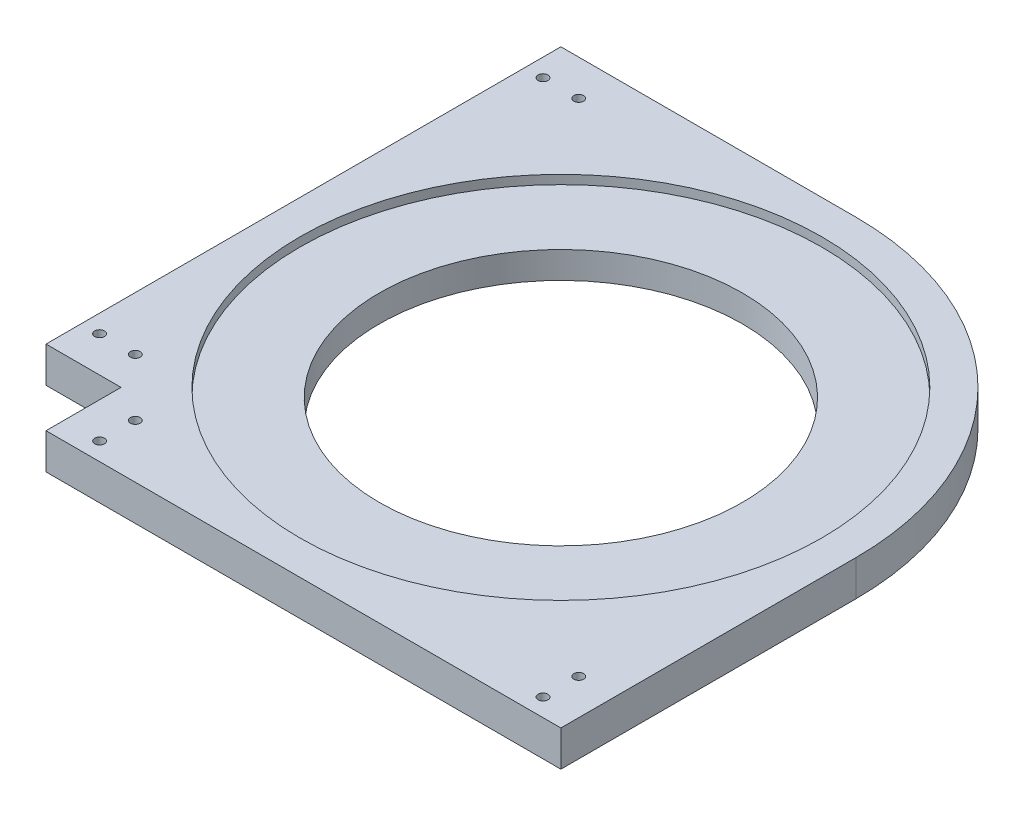
ISO-10303-21;
HEADER;
FILE_DESCRIPTION(('STEP AP214'),'2;1');
FILE_NAME('part.step','',(''),(''),'','','');
FILE_SCHEMA(('AUTOMOTIVE_DESIGN { 1 0 10303 214 1 1 1 1 }'));
ENDSEC;
DATA;
#1=APPLICATION_CONTEXT('core data for automotive mechanical design processes');
#2=APPLICATION_PROTOCOL_DEFINITION('international standard','automotive_design',2000,#1);
#3=PRODUCT_CONTEXT('',#1,'mechanical');
#4=PRODUCT('Part','Part','',(#3));
#5=PRODUCT_RELATED_PRODUCT_CATEGORY('part','',(#4));
#6=PRODUCT_DEFINITION_FORMATION('','',#4);
#7=PRODUCT_DEFINITION_CONTEXT('part definition',#1,'design');
#8=PRODUCT_DEFINITION('design','',#6,#7);
#9=PRODUCT_DEFINITION_SHAPE('','',#8);
#10=(LENGTH_UNIT() NAMED_UNIT(*) SI_UNIT(.MILLI.,.METRE.));
#11=(NAMED_UNIT(*) PLANE_ANGLE_UNIT() SI_UNIT($,.RADIAN.));
#12=(NAMED_UNIT(*) SI_UNIT($,.STERADIAN.) SOLID_ANGLE_UNIT());
#13=UNCERTAINTY_MEASURE_WITH_UNIT(LENGTH_MEASURE(1.E-05),#10,'distance_accuracy_value','');
#14=(GEOMETRIC_REPRESENTATION_CONTEXT(3) GLOBAL_UNCERTAINTY_ASSIGNED_CONTEXT((#13)) GLOBAL_UNIT_ASSIGNED_CONTEXT((#10,
#11,#12)) REPRESENTATION_CONTEXT('',''));
#15=CARTESIAN_POINT('',(0.,0.,0.));
#16=DIRECTION('',(0.,0.,1.));
#17=DIRECTION('',(1.,0.,0.));
#18=AXIS2_PLACEMENT_3D('',#15,#16,#17);
#19=CARTESIAN_POINT('',(0.,20.,0.));
#20=DIRECTION('',(0.,-1.,0.));
#21=DIRECTION('',(0.,0.,-1.));
#22=AXIS2_PLACEMENT_3D('',#19,#20,#21);
#23=CYLINDRICAL_SURFACE('',#22,165.1);
#24=CARTESIAN_POINT('',(0.,0.,0.));
#25=DIRECTION('',(0.,1.,0.));
#26=DIRECTION('',(0.,0.,1.));
#27=AXIS2_PLACEMENT_3D('',#24,#25,#26);
#28=CIRCLE('',#27,165.1);
#29=CARTESIAN_POINT('',(165.1,0.,0.));
#30=VERTEX_POINT('',#29);
#31=CARTESIAN_POINT('',(0.,0.,-165.1));
#32=VERTEX_POINT('',#31);
#33=EDGE_CURVE('E143',#30,#32,#28,.T.);
#34=ORIENTED_EDGE('',*,*,#33,.T.);
#35=DIRECTION('',(0.,-1.,0.));
#36=VECTOR('',#35,1.);
#37=CARTESIAN_POINT('',(0.,20.,-165.1));
#38=LINE('',#37,#36);
#39=CARTESIAN_POINT('',(0.,20.,-165.1));
#40=VERTEX_POINT('',#39);
#41=EDGE_CURVE('E13',#40,#32,#38,.T.);
#42=ORIENTED_EDGE('',*,*,#41,.F.);
#43=CARTESIAN_POINT('',(0.,20.,0.));
#44=DIRECTION('',(0.,1.,0.));
#45=DIRECTION('',(0.,0.,1.));
#46=AXIS2_PLACEMENT_3D('',#43,#44,#45);
#47=CIRCLE('',#46,165.1);
#48=CARTESIAN_POINT('',(165.1,20.,0.));
#49=VERTEX_POINT('',#48);
#50=EDGE_CURVE('E155',#49,#40,#47,.T.);
#51=ORIENTED_EDGE('',*,*,#50,.F.);
#52=DIRECTION('',(0.,-1.,0.));
#53=VECTOR('',#52,1.);
#54=CARTESIAN_POINT('',(165.1,20.,0.));
#55=LINE('',#54,#53);
#56=EDGE_CURVE('E138',#49,#30,#55,.T.);
#57=ORIENTED_EDGE('',*,*,#56,.T.);
#58=EDGE_LOOP('',(#34,#42,#51,#57));
#59=FACE_BOUND('',#58,.T.);
#60=ADVANCED_FACE('F48',(#59),#23,.T.);
#61=CARTESIAN_POINT('',(-165.1,20.,-165.1));
#62=DIRECTION('',(0.,0.,1.));
#63=DIRECTION('',(1.,0.,0.));
#64=AXIS2_PLACEMENT_3D('',#61,#62,#63);
#65=PLANE('',#64);
#66=DIRECTION('',(-1.,0.,0.));
#67=VECTOR('',#66,1.);
#68=CARTESIAN_POINT('',(-165.1,0.,-165.1));
#69=LINE('',#68,#67);
#70=CARTESIAN_POINT('',(-165.1,0.,-165.1));
#71=VERTEX_POINT('',#70);
#72=EDGE_CURVE('E146',#32,#71,#69,.T.);
#73=ORIENTED_EDGE('',*,*,#72,.T.);
#74=DIRECTION('',(0.,-1.,0.));
#75=VECTOR('',#74,1.);
#76=CARTESIAN_POINT('',(-165.1,20.,-165.1));
#77=LINE('',#76,#75);
#78=CARTESIAN_POINT('',(-165.1,20.,-165.1));
#79=VERTEX_POINT('',#78);
#80=EDGE_CURVE('E55',#79,#71,#77,.T.);
#81=ORIENTED_EDGE('',*,*,#80,.F.);
#82=DIRECTION('',(-1.,0.,0.));
#83=VECTOR('',#82,1.);
#84=CARTESIAN_POINT('',(-165.1,20.,-165.1));
#85=LINE('',#84,#83);
#86=EDGE_CURVE('E99',#40,#79,#85,.T.);
#87=ORIENTED_EDGE('',*,*,#86,.F.);
#88=ORIENTED_EDGE('',*,*,#41,.T.);
#89=EDGE_LOOP('',(#73,#81,#87,#88));
#90=FACE_BOUND('',#89,.T.);
#91=ADVANCED_FACE('F189',(#90),#65,.F.);
#92=CARTESIAN_POINT('',(-165.1,20.,165.1));
#93=DIRECTION('',(1.,0.,0.));
#94=DIRECTION('',(0.,0.,-1.));
#95=AXIS2_PLACEMENT_3D('',#92,#93,#94);
#96=PLANE('',#95);
#97=DIRECTION('',(0.,0.,1.));
#98=VECTOR('',#97,1.);
#99=CARTESIAN_POINT('',(-165.1,0.,165.1));
#100=LINE('',#99,#98);
#101=CARTESIAN_POINT('',(-165.1,0.,123.1));
#102=VERTEX_POINT('',#101);
#103=EDGE_CURVE('E149',#71,#102,#100,.T.);
#104=ORIENTED_EDGE('',*,*,#103,.T.);
#105=DIRECTION('',(0.,1.,0.));
#106=VECTOR('',#105,1.);
#107=CARTESIAN_POINT('',(-165.1,-0.001000000000001,123.1));
#108=LINE('',#107,#106);
#109=CARTESIAN_POINT('',(-165.1,20.,123.1));
#110=VERTEX_POINT('',#109);
#111=EDGE_CURVE('E172',#102,#110,#108,.T.);
#112=ORIENTED_EDGE('',*,*,#111,.T.);
#113=DIRECTION('',(0.,0.,1.));
#114=VECTOR('',#113,1.);
#115=CARTESIAN_POINT('',(-165.1,20.,165.1));
#116=LINE('',#115,#114);
#117=EDGE_CURVE('E136',#79,#110,#116,.T.);
#118=ORIENTED_EDGE('',*,*,#117,.F.);
#119=ORIENTED_EDGE('',*,*,#80,.T.);
#120=EDGE_LOOP('',(#104,#112,#118,#119));
#121=FACE_BOUND('',#120,.T.);
#122=ADVANCED_FACE('F161',(#121),#96,.F.);
#123=CARTESIAN_POINT('',(165.1,20.,165.1));
#124=DIRECTION('',(0.,0.,-1.));
#125=DIRECTION('',(-1.,0.,0.));
#126=AXIS2_PLACEMENT_3D('',#123,#124,#125);
#127=PLANE('',#126);
#128=DIRECTION('',(1.,0.,0.));
#129=VECTOR('',#128,1.);
#130=CARTESIAN_POINT('',(165.1,20.,165.1));
#131=LINE('',#130,#129);
#132=CARTESIAN_POINT('',(-123.1,20.,165.1));
#133=VERTEX_POINT('',#132);
#134=CARTESIAN_POINT('',(165.1,20.,165.1));
#135=VERTEX_POINT('',#134);
#136=EDGE_CURVE('E130',#133,#135,#131,.T.);
#137=ORIENTED_EDGE('',*,*,#136,.F.);
#138=DIRECTION('',(0.,1.,0.));
#139=VECTOR('',#138,1.);
#140=CARTESIAN_POINT('',(-123.1,-0.001000000000001,165.1));
#141=LINE('',#140,#139);
#142=CARTESIAN_POINT('',(-123.1,0.,165.1));
#143=VERTEX_POINT('',#142);
#144=EDGE_CURVE('E115',#143,#133,#141,.T.);
#145=ORIENTED_EDGE('',*,*,#144,.F.);
#146=DIRECTION('',(1.,0.,0.));
#147=VECTOR('',#146,1.);
#148=CARTESIAN_POINT('',(165.1,0.,165.1));
#149=LINE('',#148,#147);
#150=CARTESIAN_POINT('',(165.1,0.,165.1));
#151=VERTEX_POINT('',#150);
#152=EDGE_CURVE('E152',#143,#151,#149,.T.);
#153=ORIENTED_EDGE('',*,*,#152,.T.);
#154=DIRECTION('',(0.,-1.,0.));
#155=VECTOR('',#154,1.);
#156=CARTESIAN_POINT('',(165.1,20.,165.1));
#157=LINE('',#156,#155);
#158=EDGE_CURVE('E135',#135,#151,#157,.T.);
#159=ORIENTED_EDGE('',*,*,#158,.F.);
#160=EDGE_LOOP('',(#137,#145,#153,#159));
#161=FACE_BOUND('',#160,.T.);
#162=ADVANCED_FACE('F134',(#161),#127,.F.);
#163=CARTESIAN_POINT('',(165.1,20.,0.));
#164=DIRECTION('',(-1.,0.,0.));
#165=DIRECTION('',(0.,0.,1.));
#166=AXIS2_PLACEMENT_3D('',#163,#164,#165);
#167=PLANE('',#166);
#168=DIRECTION('',(0.,0.,-1.));
#169=VECTOR('',#168,1.);
#170=CARTESIAN_POINT('',(165.1,0.,0.));
#171=LINE('',#170,#169);
#172=EDGE_CURVE('E92',#151,#30,#171,.T.);
#173=ORIENTED_EDGE('',*,*,#172,.T.);
#174=ORIENTED_EDGE('',*,*,#56,.F.);
#175=DIRECTION('',(0.,0.,-1.));
#176=VECTOR('',#175,1.);
#177=CARTESIAN_POINT('',(165.1,20.,0.));
#178=LINE('',#177,#176);
#179=EDGE_CURVE('E71',#135,#49,#178,.T.);
#180=ORIENTED_EDGE('',*,*,#179,.F.);
#181=ORIENTED_EDGE('',*,*,#158,.T.);
#182=EDGE_LOOP('',(#173,#174,#180,#181));
#183=FACE_BOUND('',#182,.T.);
#184=ADVANCED_FACE('F199',(#183),#167,.F.);
#185=CARTESIAN_POINT('',(0.,20.,0.));
#186=DIRECTION('',(0.,1.,0.));
#187=DIRECTION('',(0.,0.,1.));
#188=AXIS2_PLACEMENT_3D('',#185,#186,#187);
#189=PLANE('',#188);
#190=CARTESIAN_POINT('',(-155.1,20.,-145.1));
#191=DIRECTION('',(0.,1.,0.));
#192=DIRECTION('',(0.,0.,-1.));
#193=AXIS2_PLACEMENT_3D('',#190,#191,#192);
#194=CIRCLE('',#193,2.74999999999997);
#195=CARTESIAN_POINT('',(-155.1,20.,-147.85));
#196=VERTEX_POINT('',#195);
#197=EDGE_CURVE('E278',#196,#196,#194,.T.);
#198=ORIENTED_EDGE('',*,*,#197,.F.);
#199=EDGE_LOOP('',(#198));
#200=FACE_BOUND('',#199,.T.);
#201=CARTESIAN_POINT('',(145.1,20.,155.1));
#202=DIRECTION('',(0.,1.,0.));
#203=DIRECTION('',(0.,0.,1.));
#204=AXIS2_PLACEMENT_3D('',#201,#202,#203);
#205=CIRCLE('',#204,2.75000000000001);
#206=CARTESIAN_POINT('',(145.1,20.,157.85));
#207=VERTEX_POINT('',#206);
#208=EDGE_CURVE('E282',#207,#207,#205,.T.);
#209=ORIENTED_EDGE('',*,*,#208,.F.);
#210=EDGE_LOOP('',(#209));
#211=FACE_BOUND('',#210,.T.);
#212=CARTESIAN_POINT('',(-103.1,20.,155.1));
#213=DIRECTION('',(0.,1.,0.));
#214=DIRECTION('',(0.,0.,1.));
#215=AXIS2_PLACEMENT_3D('',#212,#213,#214);
#216=CIRCLE('',#215,2.75000000000001);
#217=CARTESIAN_POINT('',(-103.1,20.,157.85));
#218=VERTEX_POINT('',#217);
#219=EDGE_CURVE('E289',#218,#218,#216,.T.);
#220=ORIENTED_EDGE('',*,*,#219,.F.);
#221=EDGE_LOOP('',(#220));
#222=FACE_BOUND('',#221,.T.);
#223=CARTESIAN_POINT('',(145.1,20.,135.1));
#224=DIRECTION('',(0.,1.,0.));
#225=DIRECTION('',(0.,0.,1.));
#226=AXIS2_PLACEMENT_3D('',#223,#224,#225);
#227=CIRCLE('',#226,2.75000000000001);
#228=CARTESIAN_POINT('',(145.1,20.,137.85));
#229=VERTEX_POINT('',#228);
#230=EDGE_CURVE('E294',#229,#229,#227,.T.);
#231=ORIENTED_EDGE('',*,*,#230,.F.);
#232=EDGE_LOOP('',(#231));
#233=FACE_BOUND('',#232,.T.);
#234=CARTESIAN_POINT('',(-135.1,20.,103.1));
#235=DIRECTION('',(0.,1.,0.));
#236=DIRECTION('',(0.,0.,-1.));
#237=AXIS2_PLACEMENT_3D('',#234,#235,#236);
#238=CIRCLE('',#237,2.75000000000001);
#239=CARTESIAN_POINT('',(-135.1,20.,100.35));
#240=VERTEX_POINT('',#239);
#241=EDGE_CURVE('E261',#240,#240,#238,.T.);
#242=ORIENTED_EDGE('',*,*,#241,.F.);
#243=EDGE_LOOP('',(#242));
#244=FACE_BOUND('',#243,.T.);
#245=CARTESIAN_POINT('',(-135.1,20.,-145.1));
#246=DIRECTION('',(0.,1.,0.));
#247=DIRECTION('',(0.,0.,-1.));
#248=AXIS2_PLACEMENT_3D('',#245,#246,#247);
#249=CIRCLE('',#248,2.74999999999997);
#250=CARTESIAN_POINT('',(-135.1,20.,-147.85));
#251=VERTEX_POINT('',#250);
#252=EDGE_CURVE('E266',#251,#251,#249,.T.);
#253=ORIENTED_EDGE('',*,*,#252,.F.);
#254=EDGE_LOOP('',(#253));
#255=FACE_BOUND('',#254,.T.);
#256=CARTESIAN_POINT('',(-155.1,20.,103.1));
#257=DIRECTION('',(0.,1.,0.));
#258=DIRECTION('',(0.,0.,-1.));
#259=AXIS2_PLACEMENT_3D('',#256,#257,#258);
#260=CIRCLE('',#259,2.75000000000001);
#261=CARTESIAN_POINT('',(-155.1,20.,100.35));
#262=VERTEX_POINT('',#261);
#263=EDGE_CURVE('E273',#262,#262,#260,.T.);
#264=ORIENTED_EDGE('',*,*,#263,.F.);
#265=EDGE_LOOP('',(#264));
#266=FACE_BOUND('',#265,.T.);
#267=CARTESIAN_POINT('',(-103.1,20.,135.1));
#268=DIRECTION('',(0.,1.,0.));
#269=DIRECTION('',(0.,0.,1.));
#270=AXIS2_PLACEMENT_3D('',#267,#268,#269);
#271=CIRCLE('',#270,2.75000000000001);
#272=CARTESIAN_POINT('',(-103.1,20.,137.85));
#273=VERTEX_POINT('',#272);
#274=EDGE_CURVE('E301',#273,#273,#271,.T.);
#275=ORIENTED_EDGE('',*,*,#274,.F.);
#276=EDGE_LOOP('',(#275));
#277=FACE_BOUND('',#276,.T.);
#278=DIRECTION('',(-1.,0.,0.));
#279=VECTOR('',#278,1.);
#280=CARTESIAN_POINT('',(-165.1,20.,123.1));
#281=LINE('',#280,#279);
#282=CARTESIAN_POINT('',(-123.1,20.,123.1));
#283=VERTEX_POINT('',#282);
#284=EDGE_CURVE('E126',#283,#110,#281,.T.);
#285=ORIENTED_EDGE('',*,*,#284,.F.);
#286=DIRECTION('',(0.,0.,-1.));
#287=VECTOR('',#286,1.);
#288=CARTESIAN_POINT('',(-123.1,20.,165.1));
#289=LINE('',#288,#287);
#290=EDGE_CURVE('E118',#133,#283,#289,.T.);
#291=ORIENTED_EDGE('',*,*,#290,.F.);
#292=ORIENTED_EDGE('',*,*,#136,.T.);
#293=ORIENTED_EDGE('',*,*,#179,.T.);
#294=ORIENTED_EDGE('',*,*,#50,.T.);
#295=ORIENTED_EDGE('',*,*,#86,.T.);
#296=ORIENTED_EDGE('',*,*,#117,.T.);
#297=EDGE_LOOP('',(#285,#291,#292,#293,#294,#295,#296));
#298=FACE_BOUND('',#297,.T.);
#299=CARTESIAN_POINT('',(0.,20.,0.));
#300=DIRECTION('',(0.,1.,0.));
#301=DIRECTION('',(0.,0.,1.));
#302=AXIS2_PLACEMENT_3D('',#299,#300,#301);
#303=CIRCLE('',#302,146.05);
#304=CARTESIAN_POINT('',(0.,20.,146.05));
#305=VERTEX_POINT('',#304);
#306=EDGE_CURVE('E181',#305,#305,#303,.T.);
#307=ORIENTED_EDGE('',*,*,#306,.F.);
#308=EDGE_LOOP('',(#307));
#309=FACE_BOUND('',#308,.T.);
#310=ADVANCED_FACE('F128',(#200,#211,#222,#233,#244,#255,#266,#277,#298,#309),#189,.T.);
#311=CARTESIAN_POINT('',(0.,0.,0.));
#312=DIRECTION('',(0.,1.,0.));
#313=DIRECTION('',(0.,0.,1.));
#314=AXIS2_PLACEMENT_3D('',#311,#312,#313);
#315=PLANE('',#314);
#316=CARTESIAN_POINT('',(-155.1,0.,-145.1));
#317=DIRECTION('',(0.,1.,0.));
#318=DIRECTION('',(0.,0.,1.));
#319=AXIS2_PLACEMENT_3D('',#316,#317,#318);
#320=CIRCLE('',#319,2.74999999999997);
#321=CARTESIAN_POINT('',(-155.1,0.,-142.35));
#322=VERTEX_POINT('',#321);
#323=EDGE_CURVE('E286',#322,#322,#320,.F.);
#324=ORIENTED_EDGE('',*,*,#323,.F.);
#325=EDGE_LOOP('',(#324));
#326=FACE_BOUND('',#325,.T.);
#327=CARTESIAN_POINT('',(145.1,0.,155.1));
#328=DIRECTION('',(0.,1.,0.));
#329=DIRECTION('',(0.,0.,1.));
#330=AXIS2_PLACEMENT_3D('',#327,#328,#329);
#331=CIRCLE('',#330,2.75000000000001);
#332=CARTESIAN_POINT('',(145.1,0.,157.85));
#333=VERTEX_POINT('',#332);
#334=EDGE_CURVE('E285',#333,#333,#331,.F.);
#335=ORIENTED_EDGE('',*,*,#334,.F.);
#336=EDGE_LOOP('',(#335));
#337=FACE_BOUND('',#336,.T.);
#338=CARTESIAN_POINT('',(-103.1,0.,155.1));
#339=DIRECTION('',(0.,1.,0.));
#340=DIRECTION('',(0.,0.,1.));
#341=AXIS2_PLACEMENT_3D('',#338,#339,#340);
#342=CIRCLE('',#341,2.75000000000001);
#343=CARTESIAN_POINT('',(-103.1,0.,157.85));
#344=VERTEX_POINT('',#343);
#345=EDGE_CURVE('E298',#344,#344,#342,.F.);
#346=ORIENTED_EDGE('',*,*,#345,.F.);
#347=EDGE_LOOP('',(#346));
#348=FACE_BOUND('',#347,.T.);
#349=CARTESIAN_POINT('',(145.1,0.,135.1));
#350=DIRECTION('',(0.,1.,0.));
#351=DIRECTION('',(0.,0.,1.));
#352=AXIS2_PLACEMENT_3D('',#349,#350,#351);
#353=CIRCLE('',#352,2.75000000000001);
#354=CARTESIAN_POINT('',(145.1,0.,137.85));
#355=VERTEX_POINT('',#354);
#356=EDGE_CURVE('E297',#355,#355,#353,.F.);
#357=ORIENTED_EDGE('',*,*,#356,.F.);
#358=EDGE_LOOP('',(#357));
#359=FACE_BOUND('',#358,.T.);
#360=CARTESIAN_POINT('',(-135.1,0.,103.1));
#361=DIRECTION('',(0.,1.,0.));
#362=DIRECTION('',(0.,0.,1.));
#363=AXIS2_PLACEMENT_3D('',#360,#361,#362);
#364=CIRCLE('',#363,2.75000000000001);
#365=CARTESIAN_POINT('',(-135.1,0.,105.85));
#366=VERTEX_POINT('',#365);
#367=EDGE_CURVE('E264',#366,#366,#364,.F.);
#368=ORIENTED_EDGE('',*,*,#367,.F.);
#369=EDGE_LOOP('',(#368));
#370=FACE_BOUND('',#369,.T.);
#371=CARTESIAN_POINT('',(-135.1,0.,-145.1));
#372=DIRECTION('',(0.,1.,0.));
#373=DIRECTION('',(0.,0.,1.));
#374=AXIS2_PLACEMENT_3D('',#371,#372,#373);
#375=CIRCLE('',#374,2.74999999999997);
#376=CARTESIAN_POINT('',(-135.1,0.,-142.35));
#377=VERTEX_POINT('',#376);
#378=EDGE_CURVE('E269',#377,#377,#375,.F.);
#379=ORIENTED_EDGE('',*,*,#378,.F.);
#380=EDGE_LOOP('',(#379));
#381=FACE_BOUND('',#380,.T.);
#382=CARTESIAN_POINT('',(-155.1,0.,103.1));
#383=DIRECTION('',(0.,1.,0.));
#384=DIRECTION('',(0.,0.,1.));
#385=AXIS2_PLACEMENT_3D('',#382,#383,#384);
#386=CIRCLE('',#385,2.75000000000001);
#387=CARTESIAN_POINT('',(-155.1,0.,105.85));
#388=VERTEX_POINT('',#387);
#389=EDGE_CURVE('E276',#388,#388,#386,.F.);
#390=ORIENTED_EDGE('',*,*,#389,.F.);
#391=EDGE_LOOP('',(#390));
#392=FACE_BOUND('',#391,.T.);
#393=CARTESIAN_POINT('',(-103.1,0.,135.1));
#394=DIRECTION('',(0.,1.,0.));
#395=DIRECTION('',(0.,0.,1.));
#396=AXIS2_PLACEMENT_3D('',#393,#394,#395);
#397=CIRCLE('',#396,2.75000000000001);
#398=CARTESIAN_POINT('',(-103.1,0.,137.85));
#399=VERTEX_POINT('',#398);
#400=EDGE_CURVE('E167',#399,#399,#397,.F.);
#401=ORIENTED_EDGE('',*,*,#400,.F.);
#402=EDGE_LOOP('',(#401));
#403=FACE_BOUND('',#402,.T.);
#404=CARTESIAN_POINT('',(0.,0.,0.));
#405=DIRECTION('',(0.,1.,0.));
#406=DIRECTION('',(0.,0.,1.));
#407=AXIS2_PLACEMENT_3D('',#404,#405,#406);
#408=CIRCLE('',#407,101.6);
#409=CARTESIAN_POINT('',(0.,0.,101.6));
#410=VERTEX_POINT('',#409);
#411=EDGE_CURVE('E178',#410,#410,#408,.F.);
#412=ORIENTED_EDGE('',*,*,#411,.F.);
#413=EDGE_LOOP('',(#412));
#414=FACE_BOUND('',#413,.T.);
#415=DIRECTION('',(0.,0.,1.));
#416=VECTOR('',#415,1.);
#417=CARTESIAN_POINT('',(-123.1,0.,165.1));
#418=LINE('',#417,#416);
#419=CARTESIAN_POINT('',(-123.1,0.,123.1));
#420=VERTEX_POINT('',#419);
#421=EDGE_CURVE('E121',#420,#143,#418,.T.);
#422=ORIENTED_EDGE('',*,*,#421,.F.);
#423=DIRECTION('',(1.,0.,0.));
#424=VECTOR('',#423,1.);
#425=CARTESIAN_POINT('',(-165.1,0.,123.1));
#426=LINE('',#425,#424);
#427=EDGE_CURVE('E62',#102,#420,#426,.T.);
#428=ORIENTED_EDGE('',*,*,#427,.F.);
#429=ORIENTED_EDGE('',*,*,#103,.F.);
#430=ORIENTED_EDGE('',*,*,#72,.F.);
#431=ORIENTED_EDGE('',*,*,#33,.F.);
#432=ORIENTED_EDGE('',*,*,#172,.F.);
#433=ORIENTED_EDGE('',*,*,#152,.F.);
#434=EDGE_LOOP('',(#422,#428,#429,#430,#431,#432,#433));
#435=FACE_BOUND('',#434,.T.);
#436=ADVANCED_FACE('F164',(#326,#337,#348,#359,#370,#381,#392,#403,#414,#435),#315,.F.);
#437=CARTESIAN_POINT('',(0.,15.,0.));
#438=DIRECTION('',(0.,1.,0.));
#439=DIRECTION('',(0.,0.,1.));
#440=AXIS2_PLACEMENT_3D('',#437,#438,#439);
#441=CYLINDRICAL_SURFACE('',#440,146.05);
#442=CARTESIAN_POINT('',(0.,15.,0.));
#443=DIRECTION('',(0.,1.,0.));
#444=DIRECTION('',(0.,0.,1.));
#445=AXIS2_PLACEMENT_3D('',#442,#443,#444);
#446=CIRCLE('',#445,146.05);
#447=CARTESIAN_POINT('',(0.,15.,146.05));
#448=VERTEX_POINT('',#447);
#449=EDGE_CURVE('E147',#448,#448,#446,.T.);
#450=ORIENTED_EDGE('',*,*,#449,.F.);
#451=EDGE_LOOP('',(#450));
#452=FACE_BOUND('',#451,.T.);
#453=ORIENTED_EDGE('',*,*,#306,.T.);
#454=EDGE_LOOP('',(#453));
#455=FACE_BOUND('',#454,.T.);
#456=ADVANCED_FACE('F204',(#452,#455),#441,.F.);
#457=CARTESIAN_POINT('',(0.,15.,0.));
#458=DIRECTION('',(0.,1.,0.));
#459=DIRECTION('',(0.,0.,1.));
#460=AXIS2_PLACEMENT_3D('',#457,#458,#459);
#461=PLANE('',#460);
#462=CARTESIAN_POINT('',(0.,15.,0.));
#463=DIRECTION('',(0.,1.,0.));
#464=DIRECTION('',(0.,0.,1.));
#465=AXIS2_PLACEMENT_3D('',#462,#463,#464);
#466=CIRCLE('',#465,101.6);
#467=CARTESIAN_POINT('',(0.,15.,101.6));
#468=VERTEX_POINT('',#467);
#469=EDGE_CURVE('E174',#468,#468,#466,.T.);
#470=ORIENTED_EDGE('',*,*,#469,.F.);
#471=EDGE_LOOP('',(#470));
#472=FACE_BOUND('',#471,.T.);
#473=ORIENTED_EDGE('',*,*,#449,.T.);
#474=EDGE_LOOP('',(#473));
#475=FACE_BOUND('',#474,.T.);
#476=ADVANCED_FACE('F211',(#472,#475),#461,.T.);
#477=CARTESIAN_POINT('',(0.,-0.000999999999999265,0.));
#478=DIRECTION('',(0.,1.,0.));
#479=DIRECTION('',(0.,0.,1.));
#480=AXIS2_PLACEMENT_3D('',#477,#478,#479);
#481=CYLINDRICAL_SURFACE('',#480,101.6);
#482=CARTESIAN_POINT('',(0.,15.,101.6));
#483=CARTESIAN_POINT('',(0.,14.84375,101.6));
#484=CARTESIAN_POINT('',(0.,14.6875,101.6));
#485=CARTESIAN_POINT('',(0.,14.375,101.6));
#486=CARTESIAN_POINT('',(0.,14.21875,101.6));
#487=CARTESIAN_POINT('',(0.,13.90625,101.6));
#488=CARTESIAN_POINT('',(0.,13.75,101.6));
#489=CARTESIAN_POINT('',(0.,13.4375,101.6));
#490=CARTESIAN_POINT('',(0.,13.28125,101.6));
#491=CARTESIAN_POINT('',(0.,12.96875,101.6));
#492=CARTESIAN_POINT('',(0.,12.8125,101.6));
#493=CARTESIAN_POINT('',(0.,12.5,101.6));
#494=CARTESIAN_POINT('',(0.,12.34375,101.6));
#495=CARTESIAN_POINT('',(0.,12.03125,101.6));
#496=CARTESIAN_POINT('',(0.,11.875,101.6));
#497=CARTESIAN_POINT('',(0.,11.5625,101.6));
#498=CARTESIAN_POINT('',(0.,11.40625,101.6));
#499=CARTESIAN_POINT('',(0.,11.09375,101.6));
#500=CARTESIAN_POINT('',(0.,10.9375,101.6));
#501=CARTESIAN_POINT('',(0.,10.625,101.6));
#502=CARTESIAN_POINT('',(0.,10.46875,101.6));
#503=CARTESIAN_POINT('',(0.,10.15625,101.6));
#504=CARTESIAN_POINT('',(0.,10.,101.6));
#505=CARTESIAN_POINT('',(0.,9.6875,101.6));
#506=CARTESIAN_POINT('',(0.,9.53125,101.6));
#507=CARTESIAN_POINT('',(0.,9.21875,101.6));
#508=CARTESIAN_POINT('',(0.,9.0625,101.6));
#509=CARTESIAN_POINT('',(0.,8.75,101.6));
#510=CARTESIAN_POINT('',(0.,8.59375,101.6));
#511=CARTESIAN_POINT('',(0.,8.28125,101.6));
#512=CARTESIAN_POINT('',(0.,8.125,101.6));
#513=CARTESIAN_POINT('',(0.,7.8125,101.6));
#514=CARTESIAN_POINT('',(0.,7.65625,101.6));
#515=CARTESIAN_POINT('',(0.,7.34375,101.6));
#516=CARTESIAN_POINT('',(0.,7.1875,101.6));
#517=CARTESIAN_POINT('',(0.,6.875,101.6));
#518=CARTESIAN_POINT('',(0.,6.71875,101.6));
#519=CARTESIAN_POINT('',(0.,6.40625,101.6));
#520=CARTESIAN_POINT('',(0.,6.25,101.6));
#521=CARTESIAN_POINT('',(0.,5.9375,101.6));
#522=CARTESIAN_POINT('',(0.,5.78125,101.6));
#523=CARTESIAN_POINT('',(0.,5.46875,101.6));
#524=CARTESIAN_POINT('',(0.,5.3125,101.6));
#525=CARTESIAN_POINT('',(0.,5.,101.6));
#526=CARTESIAN_POINT('',(0.,4.84375,101.6));
#527=CARTESIAN_POINT('',(0.,4.53125,101.6));
#528=CARTESIAN_POINT('',(0.,4.375,101.6));
#529=CARTESIAN_POINT('',(0.,4.0625,101.6));
#530=CARTESIAN_POINT('',(0.,3.90625,101.6));
#531=CARTESIAN_POINT('',(0.,3.59375,101.6));
#532=CARTESIAN_POINT('',(0.,3.4375,101.6));
#533=CARTESIAN_POINT('',(0.,3.125,101.6));
#534=CARTESIAN_POINT('',(0.,2.96875,101.6));
#535=CARTESIAN_POINT('',(0.,2.65625,101.6));
#536=CARTESIAN_POINT('',(0.,2.5,101.6));
#537=CARTESIAN_POINT('',(0.,2.1875,101.6));
#538=CARTESIAN_POINT('',(0.,2.03125,101.6));
#539=CARTESIAN_POINT('',(0.,1.71875,101.6));
#540=CARTESIAN_POINT('',(0.,1.5625,101.6));
#541=CARTESIAN_POINT('',(0.,1.25,101.6));
#542=CARTESIAN_POINT('',(0.,1.09375,101.6));
#543=CARTESIAN_POINT('',(0.,0.781250000000001,101.6));
#544=CARTESIAN_POINT('',(0.,0.625,101.6));
#545=CARTESIAN_POINT('',(0.,0.3125,101.6));
#546=CARTESIAN_POINT('',(0.,0.15625,101.6));
#547=CARTESIAN_POINT('',(0.,0.,101.6));
#548=B_SPLINE_CURVE_WITH_KNOTS('',3,(#482,#483,#484,#485,#486,#487,#488,#489,#490,#491,#492,
#493,#494,#495,#496,#497,#498,#499,#500,#501,#502,#503,#504,#505,#506,#507,#508,#509,#510,#511,
#512,#513,#514,#515,#516,#517,#518,#519,#520,#521,#522,#523,#524,#525,#526,#527,#528,#529,#530,
#531,#532,#533,#534,#535,#536,#537,#538,#539,#540,#541,#542,#543,#544,#545,#546,#547),
.UNSPECIFIED.,.F.,.F.,(4,2,2,2,2,2,2,2,2,2,2,2,2,2,2,2,2,2,2,2,2,2,2,2,2,2,2,2,2,2,2,2,4),(0.,
0.46875,0.937500000000001,1.40625,1.875,2.34375,2.8125,3.28125,3.75,4.21875,4.6875,5.15625,
5.625,6.09375,6.5625,7.03125,7.5,7.96875,8.4375,8.90625,9.375,9.84375,10.3125,10.78125,11.25,
11.71875,12.1875,12.65625,13.125,13.59375,14.0625,14.53125,15.),.UNSPECIFIED.);
#549=EDGE_CURVE('BSEAM215',#468,#410,#548,.T.);
#550=ORIENTED_EDGE('',*,*,#469,.T.);
#551=ORIENTED_EDGE('',*,*,#411,.T.);
#552=ORIENTED_EDGE('',*,*,#549,.T.);
#553=ORIENTED_EDGE('',*,*,#549,.F.);
#554=EDGE_LOOP('',(#550,#552,#551,#553));
#555=FACE_BOUND('',#554,.T.);
#556=ADVANCED_FACE('F215',(#555),#481,.F.);
#557=CARTESIAN_POINT('',(-165.1,-0.001000000000001,123.1));
#558=DIRECTION('',(0.,0.,-1.));
#559=DIRECTION('',(-1.,0.,0.));
#560=AXIS2_PLACEMENT_3D('',#557,#558,#559);
#561=PLANE('',#560);
#562=ORIENTED_EDGE('',*,*,#427,.T.);
#563=DIRECTION('',(0.,1.,0.));
#564=VECTOR('',#563,1.);
#565=CARTESIAN_POINT('',(-123.1,-0.001000000000001,123.1));
#566=LINE('',#565,#564);
#567=EDGE_CURVE('E125',#420,#283,#566,.T.);
#568=ORIENTED_EDGE('',*,*,#567,.T.);
#569=ORIENTED_EDGE('',*,*,#284,.T.);
#570=ORIENTED_EDGE('',*,*,#111,.F.);
#571=EDGE_LOOP('',(#562,#568,#569,#570));
#572=FACE_BOUND('',#571,.T.);
#573=ADVANCED_FACE('F219',(#572),#561,.F.);
#574=CARTESIAN_POINT('',(-123.1,-0.001000000000001,165.1));
#575=DIRECTION('',(1.,0.,0.));
#576=DIRECTION('',(0.,0.,-1.));
#577=AXIS2_PLACEMENT_3D('',#574,#575,#576);
#578=PLANE('',#577);
#579=ORIENTED_EDGE('',*,*,#421,.T.);
#580=ORIENTED_EDGE('',*,*,#144,.T.);
#581=ORIENTED_EDGE('',*,*,#290,.T.);
#582=ORIENTED_EDGE('',*,*,#567,.F.);
#583=EDGE_LOOP('',(#579,#580,#581,#582));
#584=FACE_BOUND('',#583,.T.);
#585=ADVANCED_FACE('F117',(#584),#578,.F.);
#586=CARTESIAN_POINT('',(-103.1,-0.001000000000001,135.1));
#587=DIRECTION('',(0.,1.,0.));
#588=DIRECTION('',(0.,0.,1.));
#589=AXIS2_PLACEMENT_3D('',#586,#587,#588);
#590=CYLINDRICAL_SURFACE('',#589,2.75000000000001);
#591=ORIENTED_EDGE('',*,*,#274,.T.);
#592=EDGE_LOOP('',(#591));
#593=FACE_BOUND('',#592,.T.);
#594=ORIENTED_EDGE('',*,*,#400,.T.);
#595=EDGE_LOOP('',(#594));
#596=FACE_BOUND('',#595,.T.);
#597=ADVANCED_FACE('F223',(#593,#596),#590,.F.);
#598=CARTESIAN_POINT('',(-155.1,-0.001000000000001,103.1));
#599=DIRECTION('',(0.,1.,0.));
#600=DIRECTION('',(0.,0.,1.));
#601=AXIS2_PLACEMENT_3D('',#598,#599,#600);
#602=CYLINDRICAL_SURFACE('',#601,2.75000000000001);
#603=ORIENTED_EDGE('',*,*,#263,.T.);
#604=EDGE_LOOP('',(#603));
#605=FACE_BOUND('',#604,.T.);
#606=ORIENTED_EDGE('',*,*,#389,.T.);
#607=EDGE_LOOP('',(#606));
#608=FACE_BOUND('',#607,.T.);
#609=ADVANCED_FACE('F228',(#605,#608),#602,.F.);
#610=CARTESIAN_POINT('',(-135.1,-0.001000000000001,-145.1));
#611=DIRECTION('',(0.,1.,0.));
#612=DIRECTION('',(0.,0.,1.));
#613=AXIS2_PLACEMENT_3D('',#610,#611,#612);
#614=CYLINDRICAL_SURFACE('',#613,2.74999999999997);
#615=ORIENTED_EDGE('',*,*,#252,.T.);
#616=EDGE_LOOP('',(#615));
#617=FACE_BOUND('',#616,.T.);
#618=ORIENTED_EDGE('',*,*,#378,.T.);
#619=EDGE_LOOP('',(#618));
#620=FACE_BOUND('',#619,.T.);
#621=ADVANCED_FACE('F247',(#617,#620),#614,.F.);
#622=CARTESIAN_POINT('',(-135.1,-0.001000000000001,103.1));
#623=DIRECTION('',(0.,1.,0.));
#624=DIRECTION('',(0.,0.,1.));
#625=AXIS2_PLACEMENT_3D('',#622,#623,#624);
#626=CYLINDRICAL_SURFACE('',#625,2.75000000000001);
#627=ORIENTED_EDGE('',*,*,#241,.T.);
#628=EDGE_LOOP('',(#627));
#629=FACE_BOUND('',#628,.T.);
#630=ORIENTED_EDGE('',*,*,#367,.T.);
#631=EDGE_LOOP('',(#630));
#632=FACE_BOUND('',#631,.T.);
#633=ADVANCED_FACE('F238',(#629,#632),#626,.F.);
#634=CARTESIAN_POINT('',(145.1,-0.001000000000001,135.1));
#635=DIRECTION('',(0.,1.,0.));
#636=DIRECTION('',(0.,0.,1.));
#637=AXIS2_PLACEMENT_3D('',#634,#635,#636);
#638=CYLINDRICAL_SURFACE('',#637,2.75000000000001);
#639=ORIENTED_EDGE('',*,*,#230,.T.);
#640=EDGE_LOOP('',(#639));
#641=FACE_BOUND('',#640,.T.);
#642=ORIENTED_EDGE('',*,*,#356,.T.);
#643=EDGE_LOOP('',(#642));
#644=FACE_BOUND('',#643,.T.);
#645=ADVANCED_FACE('F234',(#641,#644),#638,.F.);
#646=CARTESIAN_POINT('',(-103.1,-0.001000000000001,155.1));
#647=DIRECTION('',(0.,1.,0.));
#648=DIRECTION('',(0.,0.,1.));
#649=AXIS2_PLACEMENT_3D('',#646,#647,#648);
#650=CYLINDRICAL_SURFACE('',#649,2.75000000000001);
#651=ORIENTED_EDGE('',*,*,#219,.T.);
#652=EDGE_LOOP('',(#651));
#653=FACE_BOUND('',#652,.T.);
#654=ORIENTED_EDGE('',*,*,#345,.T.);
#655=EDGE_LOOP('',(#654));
#656=FACE_BOUND('',#655,.T.);
#657=ADVANCED_FACE('F230',(#653,#656),#650,.F.);
#658=CARTESIAN_POINT('',(145.1,-0.001000000000001,155.1));
#659=DIRECTION('',(0.,1.,0.));
#660=DIRECTION('',(0.,0.,1.));
#661=AXIS2_PLACEMENT_3D('',#658,#659,#660);
#662=CYLINDRICAL_SURFACE('',#661,2.75000000000001);
#663=ORIENTED_EDGE('',*,*,#208,.T.);
#664=EDGE_LOOP('',(#663));
#665=FACE_BOUND('',#664,.T.);
#666=ORIENTED_EDGE('',*,*,#334,.T.);
#667=EDGE_LOOP('',(#666));
#668=FACE_BOUND('',#667,.T.);
#669=ADVANCED_FACE('F233',(#665,#668),#662,.F.);
#670=CARTESIAN_POINT('',(-155.1,-0.001000000000001,-145.1));
#671=DIRECTION('',(0.,1.,0.));
#672=DIRECTION('',(0.,0.,1.));
#673=AXIS2_PLACEMENT_3D('',#670,#671,#672);
#674=CYLINDRICAL_SURFACE('',#673,2.74999999999997);
#675=ORIENTED_EDGE('',*,*,#197,.T.);
#676=EDGE_LOOP('',(#675));
#677=FACE_BOUND('',#676,.T.);
#678=ORIENTED_EDGE('',*,*,#323,.T.);
#679=EDGE_LOOP('',(#678));
#680=FACE_BOUND('',#679,.T.);
#681=ADVANCED_FACE('F240',(#677,#680),#674,.F.);
#682=CLOSED_SHELL('',(#60,#91,#122,#162,#184,#310,#436,#456,#476,#556,#573,#585,#597,#609,#621,
#633,#645,#657,#669,#681));
#683=MANIFOLD_SOLID_BREP('B2',#682);
#684=ADVANCED_BREP_SHAPE_REPRESENTATION('',(#18,#683),#14);
#685=SHAPE_DEFINITION_REPRESENTATION(#9,#684);
ENDSEC;
END-ISO-10303-21;
